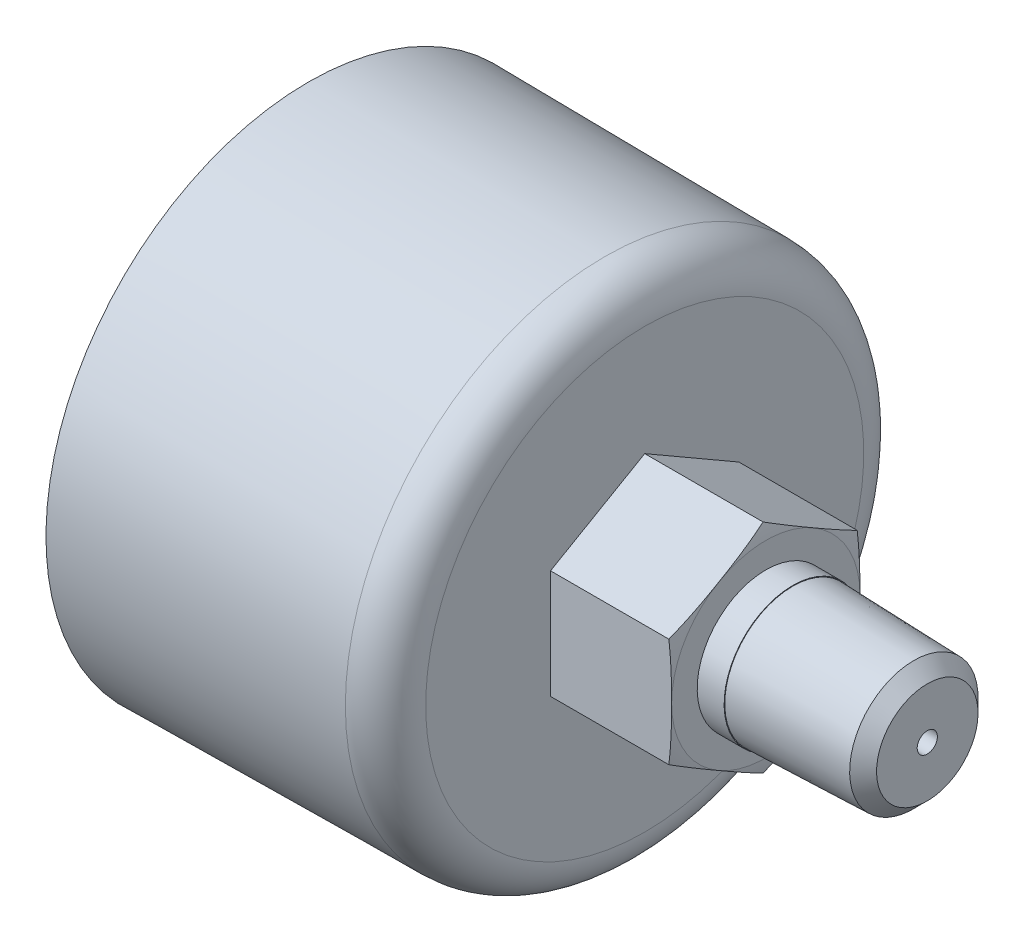
ISO-10303-21;
HEADER;
FILE_DESCRIPTION(('STEP AP214'),'2;1');
FILE_NAME('part.step','',(''),(''),'','','');
FILE_SCHEMA(('AUTOMOTIVE_DESIGN { 1 0 10303 214 1 1 1 1 }'));
ENDSEC;
DATA;
#1=APPLICATION_CONTEXT('core data for automotive mechanical design processes');
#2=APPLICATION_PROTOCOL_DEFINITION('international standard','automotive_design',2000,#1);
#3=PRODUCT_CONTEXT('',#1,'mechanical');
#4=PRODUCT('Part','Part','',(#3));
#5=PRODUCT_RELATED_PRODUCT_CATEGORY('part','',(#4));
#6=PRODUCT_DEFINITION_FORMATION('','',#4);
#7=PRODUCT_DEFINITION_CONTEXT('part definition',#1,'design');
#8=PRODUCT_DEFINITION('design','',#6,#7);
#9=PRODUCT_DEFINITION_SHAPE('','',#8);
#10=(LENGTH_UNIT() NAMED_UNIT(*) SI_UNIT(.MILLI.,.METRE.));
#11=(NAMED_UNIT(*) PLANE_ANGLE_UNIT() SI_UNIT($,.RADIAN.));
#12=(NAMED_UNIT(*) SI_UNIT($,.STERADIAN.) SOLID_ANGLE_UNIT());
#13=UNCERTAINTY_MEASURE_WITH_UNIT(LENGTH_MEASURE(1.E-05),#10,'distance_accuracy_value','');
#14=(GEOMETRIC_REPRESENTATION_CONTEXT(3) GLOBAL_UNCERTAINTY_ASSIGNED_CONTEXT((#13)) GLOBAL_UNIT_ASSIGNED_CONTEXT((#10,
#11,#12)) REPRESENTATION_CONTEXT('',''));
#15=CARTESIAN_POINT('',(0.,0.,0.));
#16=DIRECTION('',(0.,0.,1.));
#17=DIRECTION('',(1.,0.,0.));
#18=AXIS2_PLACEMENT_3D('',#15,#16,#17);
#19=CARTESIAN_POINT('',(-7.93975806058182,0.,0.));
#20=DIRECTION('',(1.,0.,0.));
#21=DIRECTION('',(0.,0.,-1.));
#22=AXIS2_PLACEMENT_3D('',#19,#20,#21);
#23=DEGENERATE_TOROIDAL_SURFACE('',#22,6.02008064647273,7.99999999999945,.T.);
#24=CARTESIAN_POINT('',(-0.210284548978179,-8.0829037686548,0.));
#25=CARTESIAN_POINT('',(0.,-7.29495989031248,1.36475883080177));
#26=CARTESIAN_POINT('',(0.,-6.06217782649109,3.50000000000003));
#27=B_SPLINE_CURVE_WITH_KNOTS('',2,(#24,#25,#26),.UNSPECIFIED.,.F.,.F.,(3,3),(0.,1.),.UNSPECIFIED.);
#28=CARTESIAN_POINT('',(-0.210284548978181,-8.0829037686548,0.));
#29=VERTEX_POINT('',#28);
#30=CARTESIAN_POINT('',(0.,-6.06217782649109,3.5));
#31=VERTEX_POINT('',#30);
#32=EDGE_CURVE('E37',#29,#31,#27,.T.);
#33=ORIENTED_EDGE('',*,*,#32,.F.);
#34=CARTESIAN_POINT('',(0.,-6.06217782649108,-3.50000000000002));
#35=CARTESIAN_POINT('',(0.,-7.29495989031246,-1.36475883080177));
#36=CARTESIAN_POINT('',(-0.210284548978179,-8.08290376865478,0.));
#37=B_SPLINE_CURVE_WITH_KNOTS('',2,(#34,#35,#36),.UNSPECIFIED.,.F.,.F.,(3,3),(0.,1.),.UNSPECIFIED.);
#38=CARTESIAN_POINT('',(0.,-6.06217782649109,-3.5));
#39=VERTEX_POINT('',#38);
#40=EDGE_CURVE('E137',#39,#29,#37,.T.);
#41=ORIENTED_EDGE('',*,*,#40,.F.);
#42=CARTESIAN_POINT('',(0.,0.,0.));
#43=DIRECTION('',(1.,0.,0.));
#44=DIRECTION('',(0.,0.,-1.));
#45=AXIS2_PLACEMENT_3D('',#42,#43,#44);
#46=CIRCLE('',#45,7.);
#47=EDGE_CURVE('E277',#31,#39,#46,.T.);
#48=ORIENTED_EDGE('',*,*,#47,.F.);
#49=EDGE_LOOP('',(#33,#41,#48));
#50=FACE_BOUND('',#49,.T.);
#51=ADVANCED_FACE('F17',(#50),#23,.T.);
#52=CARTESIAN_POINT('',(-7.93975806058182,0.,0.));
#53=DIRECTION('',(1.,0.,0.));
#54=DIRECTION('',(0.,0.,-1.));
#55=AXIS2_PLACEMENT_3D('',#52,#53,#54);
#56=DEGENERATE_TOROIDAL_SURFACE('',#55,6.02008064647273,7.99999999999945,.T.);
#57=CARTESIAN_POINT('',(-0.210284548978168,-4.0414518843274,7.));
#58=CARTESIAN_POINT('',(0.,-2.46556412764279,7.));
#59=CARTESIAN_POINT('',(0.,0.,7.));
#60=B_SPLINE_CURVE_WITH_KNOTS('',2,(#57,#58,#59),.UNSPECIFIED.,.F.,.F.,(3,3),(0.,1.),.UNSPECIFIED.);
#61=CARTESIAN_POINT('',(-0.210284548978173,-4.0414518843274,7.));
#62=VERTEX_POINT('',#61);
#63=CARTESIAN_POINT('',(0.,0.,7.));
#64=VERTEX_POINT('',#63);
#65=EDGE_CURVE('E446',#62,#64,#60,.T.);
#66=ORIENTED_EDGE('',*,*,#65,.F.);
#67=CARTESIAN_POINT('',(0.,-6.06217782649109,3.50000000000003));
#68=CARTESIAN_POINT('',(0.,-4.82939576266971,5.63524116919828));
#69=CARTESIAN_POINT('',(-0.210284548978168,-4.04145188432742,7.));
#70=B_SPLINE_CURVE_WITH_KNOTS('',2,(#67,#68,#69),.UNSPECIFIED.,.F.,.F.,(3,3),(0.,1.),.UNSPECIFIED.);
#71=EDGE_CURVE('E410',#31,#62,#70,.T.);
#72=ORIENTED_EDGE('',*,*,#71,.F.);
#73=CARTESIAN_POINT('',(0.,0.,0.));
#74=DIRECTION('',(1.,0.,0.));
#75=DIRECTION('',(0.,0.,-1.));
#76=AXIS2_PLACEMENT_3D('',#73,#74,#75);
#77=CIRCLE('',#76,7.);
#78=EDGE_CURVE('E312',#64,#31,#77,.T.);
#79=ORIENTED_EDGE('',*,*,#78,.F.);
#80=EDGE_LOOP('',(#66,#72,#79));
#81=FACE_BOUND('',#80,.T.);
#82=ADVANCED_FACE('F389',(#81),#56,.T.);
#83=CARTESIAN_POINT('',(-7.93975806058182,0.,0.));
#84=DIRECTION('',(1.,0.,0.));
#85=DIRECTION('',(0.,0.,-1.));
#86=AXIS2_PLACEMENT_3D('',#83,#84,#85);
#87=DEGENERATE_TOROIDAL_SURFACE('',#86,6.02008064647273,7.99999999999945,.T.);
#88=CARTESIAN_POINT('',(-0.210284548978168,4.0414518843274,7.));
#89=CARTESIAN_POINT('',(0.,4.82939576266971,5.63524116919825));
#90=CARTESIAN_POINT('',(0.,6.06217782649108,3.50000000000002));
#91=B_SPLINE_CURVE_WITH_KNOTS('',2,(#88,#89,#90),.UNSPECIFIED.,.F.,.F.,(3,3),(0.,1.),.UNSPECIFIED.);
#92=CARTESIAN_POINT('',(-0.210284548978173,4.0414518843274,7.));
#93=VERTEX_POINT('',#92);
#94=CARTESIAN_POINT('',(0.,6.06217782649109,3.5));
#95=VERTEX_POINT('',#94);
#96=EDGE_CURVE('E484',#93,#95,#91,.T.);
#97=ORIENTED_EDGE('',*,*,#96,.F.);
#98=CARTESIAN_POINT('',(0.,0.,7.));
#99=CARTESIAN_POINT('',(0.,2.46556412764278,7.));
#100=CARTESIAN_POINT('',(-0.210284548978168,4.0414518843274,7.));
#101=B_SPLINE_CURVE_WITH_KNOTS('',2,(#98,#99,#100),.UNSPECIFIED.,.F.,.F.,(3,3),(0.,1.),.UNSPECIFIED.);
#102=EDGE_CURVE('E324',#64,#93,#101,.T.);
#103=ORIENTED_EDGE('',*,*,#102,.F.);
#104=CARTESIAN_POINT('',(0.,0.,0.));
#105=DIRECTION('',(1.,0.,0.));
#106=DIRECTION('',(0.,0.,-1.));
#107=AXIS2_PLACEMENT_3D('',#104,#105,#106);
#108=CIRCLE('',#107,7.);
#109=EDGE_CURVE('E321',#95,#64,#108,.T.);
#110=ORIENTED_EDGE('',*,*,#109,.F.);
#111=EDGE_LOOP('',(#97,#103,#110));
#112=FACE_BOUND('',#111,.T.);
#113=ADVANCED_FACE('F394',(#112),#87,.T.);
#114=CARTESIAN_POINT('',(-7.93975806058182,0.,0.));
#115=DIRECTION('',(1.,0.,0.));
#116=DIRECTION('',(0.,0.,-1.));
#117=AXIS2_PLACEMENT_3D('',#114,#115,#116);
#118=DEGENERATE_TOROIDAL_SURFACE('',#117,6.02008064647273,7.99999999999945,.T.);
#119=CARTESIAN_POINT('',(-0.210284548978179,8.0829037686548,0.));
#120=CARTESIAN_POINT('',(0.,7.29495989031248,-1.36475883080177));
#121=CARTESIAN_POINT('',(0.,6.06217782649109,-3.50000000000003));
#122=B_SPLINE_CURVE_WITH_KNOTS('',2,(#119,#120,#121),.UNSPECIFIED.,.F.,.F.,(3,3),(0.,1.),.UNSPECIFIED.);
#123=CARTESIAN_POINT('',(-0.210284548978181,8.0829037686548,0.));
#124=VERTEX_POINT('',#123);
#125=CARTESIAN_POINT('',(0.,6.06217782649109,-3.5));
#126=VERTEX_POINT('',#125);
#127=EDGE_CURVE('E11',#124,#126,#122,.T.);
#128=ORIENTED_EDGE('',*,*,#127,.F.);
#129=CARTESIAN_POINT('',(0.,6.06217782649108,3.50000000000002));
#130=CARTESIAN_POINT('',(0.,7.29495989031246,1.36475883080177));
#131=CARTESIAN_POINT('',(-0.210284548978179,8.08290376865478,0.));
#132=B_SPLINE_CURVE_WITH_KNOTS('',2,(#129,#130,#131),.UNSPECIFIED.,.F.,.F.,(3,3),(0.,1.),.UNSPECIFIED.);
#133=EDGE_CURVE('E490',#95,#124,#132,.T.);
#134=ORIENTED_EDGE('',*,*,#133,.F.);
#135=CARTESIAN_POINT('',(0.,0.,0.));
#136=DIRECTION('',(1.,0.,0.));
#137=DIRECTION('',(0.,0.,-1.));
#138=AXIS2_PLACEMENT_3D('',#135,#136,#137);
#139=CIRCLE('',#138,7.);
#140=EDGE_CURVE('E499',#126,#95,#139,.T.);
#141=ORIENTED_EDGE('',*,*,#140,.F.);
#142=EDGE_LOOP('',(#128,#134,#141));
#143=FACE_BOUND('',#142,.T.);
#144=ADVANCED_FACE('F223',(#143),#118,.T.);
#145=CARTESIAN_POINT('',(-7.93975806058182,0.,0.));
#146=DIRECTION('',(1.,0.,0.));
#147=DIRECTION('',(0.,0.,-1.));
#148=AXIS2_PLACEMENT_3D('',#145,#146,#147);
#149=DEGENERATE_TOROIDAL_SURFACE('',#148,6.02008064647273,7.99999999999945,.T.);
#150=CARTESIAN_POINT('',(0.,6.06217782649109,-3.50000000000003));
#151=CARTESIAN_POINT('',(0.,4.82939576266972,-5.63524116919827));
#152=CARTESIAN_POINT('',(-0.210284548978168,4.04145188432742,-7.));
#153=B_SPLINE_CURVE_WITH_KNOTS('',2,(#150,#151,#152),.UNSPECIFIED.,.F.,.F.,(3,3),(0.,1.),.UNSPECIFIED.);
#154=CARTESIAN_POINT('',(-0.210284548978173,4.0414518843274,-7.));
#155=VERTEX_POINT('',#154);
#156=EDGE_CURVE('E29',#126,#155,#153,.T.);
#157=ORIENTED_EDGE('',*,*,#156,.F.);
#158=CARTESIAN_POINT('',(0.,0.,0.));
#159=DIRECTION('',(1.,0.,0.));
#160=DIRECTION('',(0.,0.,-1.));
#161=AXIS2_PLACEMENT_3D('',#158,#159,#160);
#162=CIRCLE('',#161,7.);
#163=CARTESIAN_POINT('',(0.,0.,-7.));
#164=VERTEX_POINT('',#163);
#165=EDGE_CURVE('E243',#164,#126,#162,.T.);
#166=ORIENTED_EDGE('',*,*,#165,.F.);
#167=CARTESIAN_POINT('',(-0.210284548978168,4.0414518843274,-7.));
#168=CARTESIAN_POINT('',(0.,2.46556412764279,-7.));
#169=CARTESIAN_POINT('',(0.,0.,-7.));
#170=B_SPLINE_CURVE_WITH_KNOTS('',2,(#167,#168,#169),.UNSPECIFIED.,.F.,.F.,(3,3),(0.,1.),.UNSPECIFIED.);
#171=EDGE_CURVE('E269',#155,#164,#170,.T.);
#172=ORIENTED_EDGE('',*,*,#171,.F.);
#173=EDGE_LOOP('',(#157,#166,#172));
#174=FACE_BOUND('',#173,.T.);
#175=ADVANCED_FACE('F213',(#174),#149,.T.);
#176=CARTESIAN_POINT('',(-7.93975806058182,0.,0.));
#177=DIRECTION('',(1.,0.,0.));
#178=DIRECTION('',(0.,0.,-1.));
#179=AXIS2_PLACEMENT_3D('',#176,#177,#178);
#180=DEGENERATE_TOROIDAL_SURFACE('',#179,6.02008064647273,7.99999999999945,.T.);
#181=CARTESIAN_POINT('',(0.,0.,-7.));
#182=CARTESIAN_POINT('',(0.,-2.46556412764278,-7.));
#183=CARTESIAN_POINT('',(-0.210284548978168,-4.0414518843274,-7.));
#184=B_SPLINE_CURVE_WITH_KNOTS('',2,(#181,#182,#183),.UNSPECIFIED.,.F.,.F.,(3,3),(0.,1.),.UNSPECIFIED.);
#185=CARTESIAN_POINT('',(-0.210284548978173,-4.0414518843274,-7.));
#186=VERTEX_POINT('',#185);
#187=EDGE_CURVE('E132',#164,#186,#184,.T.);
#188=ORIENTED_EDGE('',*,*,#187,.F.);
#189=CARTESIAN_POINT('',(0.,0.,0.));
#190=DIRECTION('',(1.,0.,0.));
#191=DIRECTION('',(0.,0.,-1.));
#192=AXIS2_PLACEMENT_3D('',#189,#190,#191);
#193=CIRCLE('',#192,7.);
#194=EDGE_CURVE('E235',#39,#164,#193,.T.);
#195=ORIENTED_EDGE('',*,*,#194,.F.);
#196=CARTESIAN_POINT('',(-0.210284548978168,-4.0414518843274,-7.));
#197=CARTESIAN_POINT('',(0.,-4.82939576266971,-5.63524116919825));
#198=CARTESIAN_POINT('',(0.,-6.06217782649108,-3.50000000000002));
#199=B_SPLINE_CURVE_WITH_KNOTS('',2,(#196,#197,#198),.UNSPECIFIED.,.F.,.F.,(3,3),(0.,1.),.UNSPECIFIED.);
#200=EDGE_CURVE('E279',#186,#39,#199,.T.);
#201=ORIENTED_EDGE('',*,*,#200,.F.);
#202=EDGE_LOOP('',(#188,#195,#201));
#203=FACE_BOUND('',#202,.T.);
#204=ADVANCED_FACE('F189',(#203),#180,.T.);
#205=CARTESIAN_POINT('',(-9.,8.0829037686548,0.));
#206=DIRECTION('',(0.,0.866025403784438,-0.5));
#207=DIRECTION('',(-1.,0.,0.));
#208=AXIS2_PLACEMENT_3D('',#205,#206,#207);
#209=PLANE('',#208);
#210=ORIENTED_EDGE('',*,*,#127,.T.);
#211=ORIENTED_EDGE('',*,*,#156,.T.);
#212=DIRECTION('',(1.,0.,0.));
#213=VECTOR('',#212,1.);
#214=CARTESIAN_POINT('',(-9.,4.0414518843274,-7.));
#215=LINE('',#214,#213);
#216=CARTESIAN_POINT('',(-9.,4.0414518843274,-7.));
#217=VERTEX_POINT('',#216);
#218=EDGE_CURVE('E211',#217,#155,#215,.T.);
#219=ORIENTED_EDGE('',*,*,#218,.F.);
#220=DIRECTION('',(0.,-0.5,-0.866025403784438));
#221=VECTOR('',#220,1.);
#222=CARTESIAN_POINT('',(-9.,8.09003142280733,0.0123454591309524));
#223=LINE('',#222,#221);
#224=CARTESIAN_POINT('',(-9.,8.0829037686548,0.));
#225=VERTEX_POINT('',#224);
#226=EDGE_CURVE('E121',#225,#217,#223,.T.);
#227=ORIENTED_EDGE('',*,*,#226,.F.);
#228=DIRECTION('',(1.,0.,0.));
#229=VECTOR('',#228,1.);
#230=CARTESIAN_POINT('',(-9.,8.0829037686548,0.));
#231=LINE('',#230,#229);
#232=EDGE_CURVE('E271',#225,#124,#231,.T.);
#233=ORIENTED_EDGE('',*,*,#232,.T.);
#234=EDGE_LOOP('',(#210,#211,#219,#227,#233));
#235=FACE_BOUND('',#234,.T.);
#236=ADVANCED_FACE('F180',(#235),#209,.T.);
#237=CARTESIAN_POINT('',(-9.,4.0414518843274,-7.));
#238=DIRECTION('',(0.,0.,-1.));
#239=DIRECTION('',(-1.,0.,0.));
#240=AXIS2_PLACEMENT_3D('',#237,#238,#239);
#241=PLANE('',#240);
#242=ORIENTED_EDGE('',*,*,#171,.T.);
#243=ORIENTED_EDGE('',*,*,#187,.T.);
#244=DIRECTION('',(1.,0.,0.));
#245=VECTOR('',#244,1.);
#246=CARTESIAN_POINT('',(-9.,-4.0414518843274,-7.));
#247=LINE('',#246,#245);
#248=CARTESIAN_POINT('',(-9.,-4.0414518843274,-7.));
#249=VERTEX_POINT('',#248);
#250=EDGE_CURVE('E128',#249,#186,#247,.T.);
#251=ORIENTED_EDGE('',*,*,#250,.F.);
#252=DIRECTION('',(0.,-1.,0.));
#253=VECTOR('',#252,1.);
#254=CARTESIAN_POINT('',(-9.,6.0906884431012,-7.));
#255=LINE('',#254,#253);
#256=EDGE_CURVE('E111',#217,#249,#255,.T.);
#257=ORIENTED_EDGE('',*,*,#256,.F.);
#258=ORIENTED_EDGE('',*,*,#218,.T.);
#259=EDGE_LOOP('',(#242,#243,#251,#257,#258));
#260=FACE_BOUND('',#259,.T.);
#261=ADVANCED_FACE('F130',(#260),#241,.T.);
#262=CARTESIAN_POINT('',(-9.,-4.0414518843274,-7.));
#263=DIRECTION('',(0.,-0.866025403784438,-0.5));
#264=DIRECTION('',(-1.,0.,0.));
#265=AXIS2_PLACEMENT_3D('',#262,#263,#264);
#266=PLANE('',#265);
#267=ORIENTED_EDGE('',*,*,#200,.T.);
#268=ORIENTED_EDGE('',*,*,#40,.T.);
#269=DIRECTION('',(1.,0.,0.));
#270=VECTOR('',#269,1.);
#271=CARTESIAN_POINT('',(-9.,-8.0829037686548,0.));
#272=LINE('',#271,#270);
#273=CARTESIAN_POINT('',(-9.,-8.0829037686548,0.));
#274=VERTEX_POINT('',#273);
#275=EDGE_CURVE('E142',#274,#29,#272,.T.);
#276=ORIENTED_EDGE('',*,*,#275,.F.);
#277=DIRECTION('',(0.,-0.5,0.866025403784438));
#278=VECTOR('',#277,1.);
#279=CARTESIAN_POINT('',(-9.,-4.03432423017486,-7.01234545913098));
#280=LINE('',#279,#278);
#281=EDGE_CURVE('E118',#249,#274,#280,.T.);
#282=ORIENTED_EDGE('',*,*,#281,.F.);
#283=ORIENTED_EDGE('',*,*,#250,.T.);
#284=EDGE_LOOP('',(#267,#268,#276,#282,#283));
#285=FACE_BOUND('',#284,.T.);
#286=ADVANCED_FACE('F140',(#285),#266,.T.);
#287=CARTESIAN_POINT('',(6.,0.,0.));
#288=DIRECTION('',(1.,0.,0.));
#289=DIRECTION('',(0.,1.,0.));
#290=AXIS2_PLACEMENT_3D('',#287,#288,#289);
#291=CYLINDRICAL_SURFACE('',#290,0.75);
#292=CARTESIAN_POINT('',(12.,0.,0.));
#293=DIRECTION('',(-1.,0.,0.));
#294=DIRECTION('',(0.,1.,0.));
#295=AXIS2_PLACEMENT_3D('',#292,#293,#294);
#296=CIRCLE('',#295,0.75);
#297=CARTESIAN_POINT('',(12.,0.75,0.));
#298=VERTEX_POINT('',#297);
#299=EDGE_CURVE('E138',#298,#298,#296,.T.);
#300=ORIENTED_EDGE('',*,*,#299,.F.);
#301=EDGE_LOOP('',(#300));
#302=FACE_BOUND('',#301,.T.);
#303=CARTESIAN_POINT('',(0.,0.,0.));
#304=DIRECTION('',(1.,0.,0.));
#305=DIRECTION('',(0.,1.,0.));
#306=AXIS2_PLACEMENT_3D('',#303,#304,#305);
#307=CIRCLE('',#306,0.75);
#308=CARTESIAN_POINT('',(0.,0.75,0.));
#309=VERTEX_POINT('',#308);
#310=EDGE_CURVE('E155',#309,#309,#307,.T.);
#311=ORIENTED_EDGE('',*,*,#310,.F.);
#312=EDGE_LOOP('',(#311));
#313=FACE_BOUND('',#312,.T.);
#314=ADVANCED_FACE('F224',(#302,#313),#291,.F.);
#315=CARTESIAN_POINT('',(12.,2.2601706871779,0.));
#316=DIRECTION('',(1.,0.,0.));
#317=DIRECTION('',(0.,0.,-1.));
#318=AXIS2_PLACEMENT_3D('',#315,#316,#317);
#319=PLANE('',#318);
#320=CARTESIAN_POINT('',(12.,0.,0.));
#321=DIRECTION('',(-1.,0.,0.));
#322=DIRECTION('',(0.,1.,0.));
#323=AXIS2_PLACEMENT_3D('',#320,#321,#322);
#324=CIRCLE('',#323,3.7703413743558);
#325=CARTESIAN_POINT('',(12.,3.7703413743558,0.));
#326=VERTEX_POINT('',#325);
#327=EDGE_CURVE('E154',#326,#326,#324,.T.);
#328=ORIENTED_EDGE('',*,*,#327,.F.);
#329=EDGE_LOOP('',(#328));
#330=FACE_BOUND('',#329,.T.);
#331=ORIENTED_EDGE('',*,*,#299,.T.);
#332=EDGE_LOOP('',(#331));
#333=FACE_BOUND('',#332,.T.);
#334=ADVANCED_FACE('F361',(#330,#333),#319,.T.);
#335=CARTESIAN_POINT('',(11.5,0.,0.));
#336=DIRECTION('',(-1.,0.,0.));
#337=DIRECTION('',(0.,1.,0.));
#338=AXIS2_PLACEMENT_3D('',#335,#336,#337);
#339=CONICAL_SURFACE('',#338,4.2703413743558,0.785398163397448);
#340=CARTESIAN_POINT('',(11.,0.,0.));
#341=DIRECTION('',(-1.,0.,0.));
#342=DIRECTION('',(0.,1.,0.));
#343=AXIS2_PLACEMENT_3D('',#340,#341,#342);
#344=CIRCLE('',#343,4.7703413743558);
#345=CARTESIAN_POINT('',(11.,4.7703413743558,0.));
#346=VERTEX_POINT('',#345);
#347=EDGE_CURVE('E168',#346,#346,#344,.T.);
#348=ORIENTED_EDGE('',*,*,#347,.F.);
#349=EDGE_LOOP('',(#348));
#350=FACE_BOUND('',#349,.T.);
#351=ORIENTED_EDGE('',*,*,#327,.T.);
#352=EDGE_LOOP('',(#351));
#353=FACE_BOUND('',#352,.T.);
#354=ADVANCED_FACE('F358',(#350,#353),#339,.T.);
#355=CARTESIAN_POINT('',(6.5,0.,0.));
#356=DIRECTION('',(-1.,0.,0.));
#357=DIRECTION('',(0.,1.,0.));
#358=AXIS2_PLACEMENT_3D('',#355,#356,#357);
#359=CONICAL_SURFACE('',#358,4.9108293128221,0.0312094049979766);
#360=CARTESIAN_POINT('',(2.,0.,0.));
#361=DIRECTION('',(-1.,0.,0.));
#362=DIRECTION('',(0.,1.,0.));
#363=AXIS2_PLACEMENT_3D('',#360,#361,#362);
#364=CIRCLE('',#363,5.0513172512884);
#365=CARTESIAN_POINT('',(2.,5.0513172512884,0.));
#366=VERTEX_POINT('',#365);
#367=EDGE_CURVE('E164',#366,#366,#364,.T.);
#368=ORIENTED_EDGE('',*,*,#367,.F.);
#369=EDGE_LOOP('',(#368));
#370=FACE_BOUND('',#369,.T.);
#371=ORIENTED_EDGE('',*,*,#347,.T.);
#372=EDGE_LOOP('',(#371));
#373=FACE_BOUND('',#372,.T.);
#374=ADVANCED_FACE('F356',(#370,#373),#359,.T.);
#375=CARTESIAN_POINT('',(2.,5.0756586256442,0.));
#376=DIRECTION('',(1.,0.,0.));
#377=DIRECTION('',(0.,0.,-1.));
#378=AXIS2_PLACEMENT_3D('',#375,#376,#377);
#379=PLANE('',#378);
#380=CARTESIAN_POINT('',(2.,0.,0.));
#381=DIRECTION('',(-1.,0.,0.));
#382=DIRECTION('',(0.,1.,0.));
#383=AXIS2_PLACEMENT_3D('',#380,#381,#382);
#384=CIRCLE('',#383,5.1);
#385=CARTESIAN_POINT('',(2.,5.1,0.));
#386=VERTEX_POINT('',#385);
#387=EDGE_CURVE('E169',#386,#386,#384,.T.);
#388=ORIENTED_EDGE('',*,*,#387,.F.);
#389=EDGE_LOOP('',(#388));
#390=FACE_BOUND('',#389,.T.);
#391=ORIENTED_EDGE('',*,*,#367,.T.);
#392=EDGE_LOOP('',(#391));
#393=FACE_BOUND('',#392,.T.);
#394=ADVANCED_FACE('F552',(#390,#393),#379,.T.);
#395=CARTESIAN_POINT('',(1.,0.,0.));
#396=DIRECTION('',(1.,0.,0.));
#397=DIRECTION('',(0.,1.,0.));
#398=AXIS2_PLACEMENT_3D('',#395,#396,#397);
#399=CYLINDRICAL_SURFACE('',#398,5.1);
#400=CARTESIAN_POINT('',(0.,0.,0.));
#401=DIRECTION('',(-1.,0.,0.));
#402=DIRECTION('',(0.,1.,0.));
#403=AXIS2_PLACEMENT_3D('',#400,#401,#402);
#404=CIRCLE('',#403,5.1);
#405=CARTESIAN_POINT('',(0.,5.1,0.));
#406=VERTEX_POINT('',#405);
#407=EDGE_CURVE('E313',#406,#406,#404,.T.);
#408=ORIENTED_EDGE('',*,*,#407,.F.);
#409=EDGE_LOOP('',(#408));
#410=FACE_BOUND('',#409,.T.);
#411=ORIENTED_EDGE('',*,*,#387,.T.);
#412=EDGE_LOOP('',(#411));
#413=FACE_BOUND('',#412,.T.);
#414=ADVANCED_FACE('F596',(#410,#413),#399,.T.);
#415=CARTESIAN_POINT('',(0.,0.,0.));
#416=DIRECTION('',(1.,0.,0.));
#417=DIRECTION('',(0.,0.,-1.));
#418=AXIS2_PLACEMENT_3D('',#415,#416,#417);
#419=PLANE('',#418);
#420=ORIENTED_EDGE('',*,*,#194,.T.);
#421=ORIENTED_EDGE('',*,*,#165,.T.);
#422=ORIENTED_EDGE('',*,*,#140,.T.);
#423=ORIENTED_EDGE('',*,*,#109,.T.);
#424=ORIENTED_EDGE('',*,*,#78,.T.);
#425=ORIENTED_EDGE('',*,*,#47,.T.);
#426=EDGE_LOOP('',(#420,#421,#422,#423,#424,#425));
#427=FACE_BOUND('',#426,.T.);
#428=ORIENTED_EDGE('',*,*,#407,.T.);
#429=EDGE_LOOP('',(#428));
#430=FACE_BOUND('',#429,.T.);
#431=ADVANCED_FACE('F19',(#427,#430),#419,.T.);
#432=CARTESIAN_POINT('',(-9.,-4.0414518843274,7.));
#433=DIRECTION('',(0.,0.,1.));
#434=DIRECTION('',(1.,0.,0.));
#435=AXIS2_PLACEMENT_3D('',#432,#433,#434);
#436=PLANE('',#435);
#437=ORIENTED_EDGE('',*,*,#102,.T.);
#438=DIRECTION('',(1.,0.,0.));
#439=VECTOR('',#438,1.);
#440=CARTESIAN_POINT('',(-9.,4.0414518843274,7.));
#441=LINE('',#440,#439);
#442=CARTESIAN_POINT('',(-9.,4.0414518843274,7.));
#443=VERTEX_POINT('',#442);
#444=EDGE_CURVE('E486',#443,#93,#441,.T.);
#445=ORIENTED_EDGE('',*,*,#444,.F.);
#446=DIRECTION('',(0.,1.,0.));
#447=VECTOR('',#446,1.);
#448=CARTESIAN_POINT('',(-9.,2.0492365587738,7.));
#449=LINE('',#448,#447);
#450=CARTESIAN_POINT('',(-9.,-4.0414518843274,7.));
#451=VERTEX_POINT('',#450);
#452=EDGE_CURVE('E158',#451,#443,#449,.T.);
#453=ORIENTED_EDGE('',*,*,#452,.F.);
#454=DIRECTION('',(1.,0.,0.));
#455=VECTOR('',#454,1.);
#456=CARTESIAN_POINT('',(-9.,-4.0414518843274,7.));
#457=LINE('',#456,#455);
#458=EDGE_CURVE('E326',#451,#62,#457,.T.);
#459=ORIENTED_EDGE('',*,*,#458,.T.);
#460=ORIENTED_EDGE('',*,*,#65,.T.);
#461=EDGE_LOOP('',(#437,#445,#453,#459,#460));
#462=FACE_BOUND('',#461,.T.);
#463=ADVANCED_FACE('F422',(#462),#436,.T.);
#464=CARTESIAN_POINT('',(-9.,4.0414518843274,7.));
#465=DIRECTION('',(0.,0.866025403784438,0.5));
#466=DIRECTION('',(1.,0.,0.));
#467=AXIS2_PLACEMENT_3D('',#464,#465,#466);
#468=PLANE('',#467);
#469=ORIENTED_EDGE('',*,*,#133,.T.);
#470=ORIENTED_EDGE('',*,*,#232,.F.);
#471=DIRECTION('',(0.,0.5,-0.866025403784438));
#472=VECTOR('',#471,1.);
#473=CARTESIAN_POINT('',(-9.,6.06930548064363,3.48765454086905));
#474=LINE('',#473,#472);
#475=EDGE_CURVE('E329',#443,#225,#474,.T.);
#476=ORIENTED_EDGE('',*,*,#475,.F.);
#477=ORIENTED_EDGE('',*,*,#444,.T.);
#478=ORIENTED_EDGE('',*,*,#96,.T.);
#479=EDGE_LOOP('',(#469,#470,#476,#477,#478));
#480=FACE_BOUND('',#479,.T.);
#481=ADVANCED_FACE('F383',(#480),#468,.T.);
#482=CARTESIAN_POINT('',(-9.,-8.0829037686548,0.));
#483=DIRECTION('',(0.,-0.866025403784438,0.5));
#484=DIRECTION('',(1.,0.,0.));
#485=AXIS2_PLACEMENT_3D('',#482,#483,#484);
#486=PLANE('',#485);
#487=ORIENTED_EDGE('',*,*,#71,.T.);
#488=ORIENTED_EDGE('',*,*,#458,.F.);
#489=DIRECTION('',(0.,0.5,0.866025403784438));
#490=VECTOR('',#489,1.);
#491=CARTESIAN_POINT('',(-9.,-6.05505017233856,3.51234545913098));
#492=LINE('',#491,#490);
#493=EDGE_CURVE('E144',#274,#451,#492,.T.);
#494=ORIENTED_EDGE('',*,*,#493,.F.);
#495=ORIENTED_EDGE('',*,*,#275,.T.);
#496=ORIENTED_EDGE('',*,*,#32,.T.);
#497=EDGE_LOOP('',(#487,#488,#494,#495,#496));
#498=FACE_BOUND('',#497,.T.);
#499=ADVANCED_FACE('F374',(#498),#486,.T.);
#500=CARTESIAN_POINT('',(0.,0.,0.));
#501=DIRECTION('',(1.,0.,0.));
#502=DIRECTION('',(0.,0.,-1.));
#503=AXIS2_PLACEMENT_3D('',#500,#501,#502);
#504=PLANE('',#503);
#505=ORIENTED_EDGE('',*,*,#310,.T.);
#506=EDGE_LOOP('',(#505));
#507=FACE_BOUND('',#506,.T.);
#508=ADVANCED_FACE('F372',(#507),#504,.T.);
#509=CARTESIAN_POINT('',(-9.,8.139925001875,0.));
#510=DIRECTION('',(1.,0.,0.));
#511=DIRECTION('',(0.,0.,-1.));
#512=AXIS2_PLACEMENT_3D('',#509,#510,#511);
#513=PLANE('',#512);
#514=ORIENTED_EDGE('',*,*,#452,.T.);
#515=ORIENTED_EDGE('',*,*,#475,.T.);
#516=ORIENTED_EDGE('',*,*,#226,.T.);
#517=ORIENTED_EDGE('',*,*,#256,.T.);
#518=ORIENTED_EDGE('',*,*,#281,.T.);
#519=ORIENTED_EDGE('',*,*,#493,.T.);
#520=EDGE_LOOP('',(#514,#515,#516,#517,#518,#519));
#521=FACE_BOUND('',#520,.T.);
#522=CARTESIAN_POINT('',(-9.,0.,0.));
#523=DIRECTION('',(-1.,0.,0.));
#524=DIRECTION('',(0.,1.,0.));
#525=AXIS2_PLACEMENT_3D('',#522,#523,#524);
#526=CIRCLE('',#525,16.27985000375);
#527=CARTESIAN_POINT('',(-9.,16.27985000375,0.));
#528=VERTEX_POINT('',#527);
#529=EDGE_CURVE('E146',#528,#528,#526,.T.);
#530=ORIENTED_EDGE('',*,*,#529,.F.);
#531=EDGE_LOOP('',(#530));
#532=FACE_BOUND('',#531,.T.);
#533=ADVANCED_FACE('F114',(#521,#532),#513,.T.);
#534=CARTESIAN_POINT('',(-12.0000000000005,0.,0.));
#535=DIRECTION('',(-1.,0.,0.));
#536=DIRECTION('',(0.,0.,1.));
#537=AXIS2_PLACEMENT_3D('',#534,#535,#536);
#538=TOROIDAL_SURFACE('',#537,16.2798500037495,3.00000000000046);
#539=CARTESIAN_POINT('',(-11.970001499888,0.,0.));
#540=DIRECTION('',(-1.,0.,0.));
#541=DIRECTION('',(0.,1.,0.));
#542=AXIS2_PLACEMENT_3D('',#539,#540,#541);
#543=CIRCLE('',#542,19.279700014999);
#544=CARTESIAN_POINT('',(-11.970001499888,19.279700014999,0.));
#545=VERTEX_POINT('',#544);
#546=EDGE_CURVE('E159',#545,#545,#543,.T.);
#547=ORIENTED_EDGE('',*,*,#546,.F.);
#548=EDGE_LOOP('',(#547));
#549=FACE_BOUND('',#548,.T.);
#550=ORIENTED_EDGE('',*,*,#529,.T.);
#551=EDGE_LOOP('',(#550));
#552=FACE_BOUND('',#551,.T.);
#553=ADVANCED_FACE('F382',(#549,#552),#538,.T.);
#554=CARTESIAN_POINT('',(-22.985000749944,0.,0.));
#555=DIRECTION('',(-1.,0.,0.));
#556=DIRECTION('',(0.,1.,0.));
#557=AXIS2_PLACEMENT_3D('',#554,#555,#556);
#558=CONICAL_SURFACE('',#557,19.3898500074995,0.00999966668665027);
#559=CARTESIAN_POINT('',(-34.,0.,0.));
#560=DIRECTION('',(-1.,0.,0.));
#561=DIRECTION('',(0.,1.,0.));
#562=AXIS2_PLACEMENT_3D('',#559,#560,#561);
#563=CIRCLE('',#562,19.5);
#564=CARTESIAN_POINT('',(-34.,19.5,0.));
#565=VERTEX_POINT('',#564);
#566=EDGE_CURVE('E163',#565,#565,#563,.T.);
#567=ORIENTED_EDGE('',*,*,#566,.F.);
#568=EDGE_LOOP('',(#567));
#569=FACE_BOUND('',#568,.T.);
#570=ORIENTED_EDGE('',*,*,#546,.T.);
#571=EDGE_LOOP('',(#570));
#572=FACE_BOUND('',#571,.T.);
#573=ADVANCED_FACE('F640',(#569,#572),#558,.T.);
#574=CARTESIAN_POINT('',(-34.,19.375,0.));
#575=DIRECTION('',(-1.,0.,0.));
#576=DIRECTION('',(0.,0.,1.));
#577=AXIS2_PLACEMENT_3D('',#574,#575,#576);
#578=PLANE('',#577);
#579=CARTESIAN_POINT('',(-34.,0.,0.));
#580=DIRECTION('',(-1.,0.,0.));
#581=DIRECTION('',(0.,1.,0.));
#582=AXIS2_PLACEMENT_3D('',#579,#580,#581);
#583=CIRCLE('',#582,19.25);
#584=CARTESIAN_POINT('',(-34.,19.25,0.));
#585=VERTEX_POINT('',#584);
#586=EDGE_CURVE('E330',#585,#585,#583,.T.);
#587=ORIENTED_EDGE('',*,*,#586,.F.);
#588=EDGE_LOOP('',(#587));
#589=FACE_BOUND('',#588,.T.);
#590=ORIENTED_EDGE('',*,*,#566,.T.);
#591=EDGE_LOOP('',(#590));
#592=FACE_BOUND('',#591,.T.);
#593=ADVANCED_FACE('F226',(#589,#592),#578,.T.);
#594=CARTESIAN_POINT('',(-33.75,0.,0.));
#595=DIRECTION('',(1.,0.,0.));
#596=DIRECTION('',(0.,1.,0.));
#597=AXIS2_PLACEMENT_3D('',#594,#595,#596);
#598=CYLINDRICAL_SURFACE('',#597,19.25);
#599=CARTESIAN_POINT('',(-33.5,0.,0.));
#600=DIRECTION('',(-1.,0.,0.));
#601=DIRECTION('',(0.,1.,0.));
#602=AXIS2_PLACEMENT_3D('',#599,#600,#601);
#603=CIRCLE('',#602,19.25);
#604=CARTESIAN_POINT('',(-33.5,19.25,0.));
#605=VERTEX_POINT('',#604);
#606=EDGE_CURVE('E334',#605,#605,#603,.T.);
#607=ORIENTED_EDGE('',*,*,#606,.F.);
#608=EDGE_LOOP('',(#607));
#609=FACE_BOUND('',#608,.T.);
#610=ORIENTED_EDGE('',*,*,#586,.T.);
#611=EDGE_LOOP('',(#610));
#612=FACE_BOUND('',#611,.T.);
#613=ADVANCED_FACE('F190',(#609,#612),#598,.F.);
#614=CARTESIAN_POINT('',(-33.5,9.625,0.));
#615=DIRECTION('',(-1.,0.,0.));
#616=DIRECTION('',(0.,0.,1.));
#617=AXIS2_PLACEMENT_3D('',#614,#615,#616);
#618=PLANE('',#617);
#619=ORIENTED_EDGE('',*,*,#606,.T.);
#620=EDGE_LOOP('',(#619));
#621=FACE_BOUND('',#620,.T.);
#622=ADVANCED_FACE('F399',(#621),#618,.T.);
#623=CLOSED_SHELL('',(#51,#82,#113,#144,#175,#204,#236,#261,#286,#314,#334,#354,#374,#394,#414,
#431,#463,#481,#499,#508,#533,#553,#573,#593,#613,#622));
#624=MANIFOLD_SOLID_BREP('B1',#623);
#625=ADVANCED_BREP_SHAPE_REPRESENTATION('',(#18,#624),#14);
#626=SHAPE_DEFINITION_REPRESENTATION(#9,#625);
ENDSEC;
END-ISO-10303-21;
